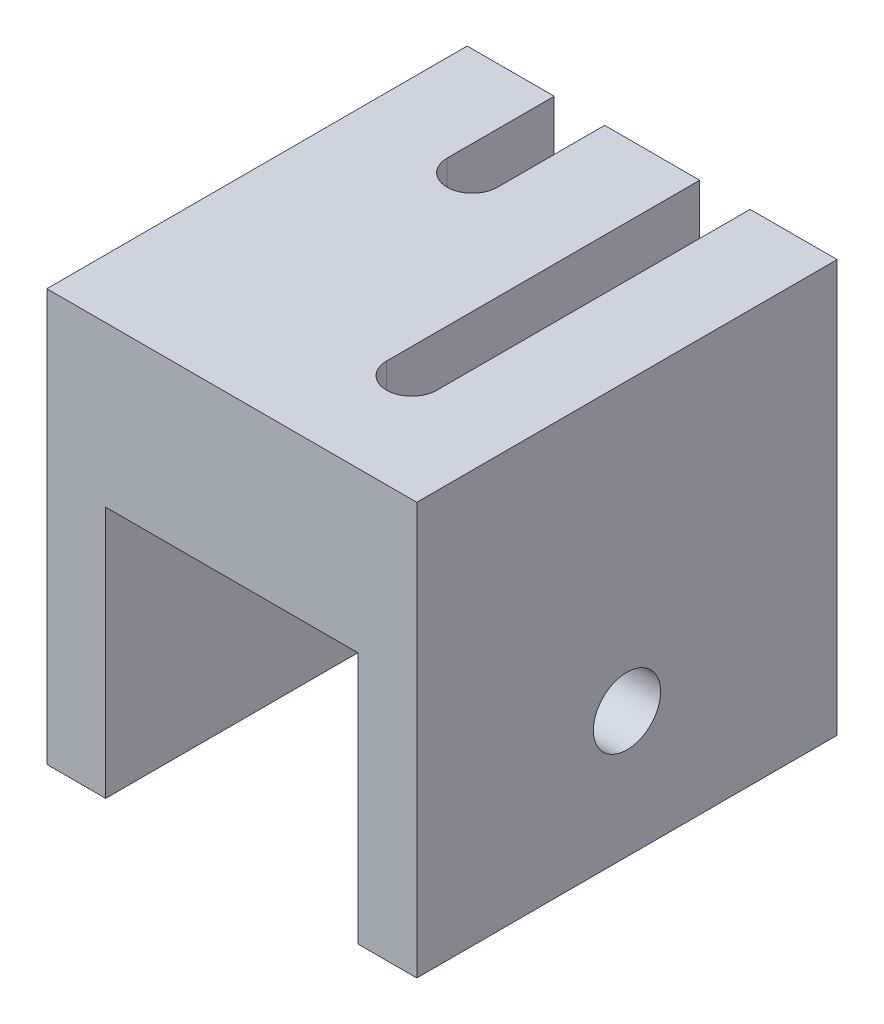
ISO-10303-21;
HEADER;
FILE_DESCRIPTION(('STEP AP214'),'2;1');
FILE_NAME('part.step','',(''),(''),'','','');
FILE_SCHEMA(('AUTOMOTIVE_DESIGN { 1 0 10303 214 1 1 1 1 }'));
ENDSEC;
DATA;
#1=APPLICATION_CONTEXT('core data for automotive mechanical design processes');
#2=APPLICATION_PROTOCOL_DEFINITION('international standard','automotive_design',2000,#1);
#3=PRODUCT_CONTEXT('',#1,'mechanical');
#4=PRODUCT('Part','Part','',(#3));
#5=PRODUCT_RELATED_PRODUCT_CATEGORY('part','',(#4));
#6=PRODUCT_DEFINITION_FORMATION('','',#4);
#7=PRODUCT_DEFINITION_CONTEXT('part definition',#1,'design');
#8=PRODUCT_DEFINITION('design','',#6,#7);
#9=PRODUCT_DEFINITION_SHAPE('','',#8);
#10=(LENGTH_UNIT() NAMED_UNIT(*) SI_UNIT(.MILLI.,.METRE.));
#11=(NAMED_UNIT(*) PLANE_ANGLE_UNIT() SI_UNIT($,.RADIAN.));
#12=(NAMED_UNIT(*) SI_UNIT($,.STERADIAN.) SOLID_ANGLE_UNIT());
#13=UNCERTAINTY_MEASURE_WITH_UNIT(LENGTH_MEASURE(1.E-05),#10,'distance_accuracy_value','');
#14=(GEOMETRIC_REPRESENTATION_CONTEXT(3) GLOBAL_UNCERTAINTY_ASSIGNED_CONTEXT((#13)) GLOBAL_UNIT_ASSIGNED_CONTEXT((#10,
#11,#12)) REPRESENTATION_CONTEXT('',''));
#15=CARTESIAN_POINT('',(0.,0.,0.));
#16=DIRECTION('',(0.,0.,1.));
#17=DIRECTION('',(1.,0.,0.));
#18=AXIS2_PLACEMENT_3D('',#15,#16,#17);
#19=CARTESIAN_POINT('',(0.,22.,50.));
#20=DIRECTION('',(0.,1.,0.));
#21=DIRECTION('',(0.,0.,1.));
#22=AXIS2_PLACEMENT_3D('',#19,#20,#21);
#23=PLANE('',#22);
#24=CARTESIAN_POINT('',(8.65024796436644,22.,37.2545179486985));
#25=DIRECTION('',(0.,1.,0.));
#26=DIRECTION('',(0.,0.,1.));
#27=AXIS2_PLACEMENT_3D('',#24,#25,#26);
#28=CIRCLE('',#27,5.);
#29=CARTESIAN_POINT('',(3.65024796436644,22.,37.2545179486985));
#30=VERTEX_POINT('',#29);
#31=CARTESIAN_POINT('',(13.6502479643664,22.,37.2545179486985));
#32=VERTEX_POINT('',#31);
#33=EDGE_CURVE('E229',#30,#32,#28,.T.);
#34=ORIENTED_EDGE('',*,*,#33,.T.);
#35=DIRECTION('',(0.,0.,-1.));
#36=VECTOR('',#35,1.);
#37=CARTESIAN_POINT('',(13.6502479643664,22.,0.));
#38=LINE('',#37,#36);
#39=CARTESIAN_POINT('',(13.6502479643664,22.,0.));
#40=VERTEX_POINT('',#39);
#41=EDGE_CURVE('E242',#32,#40,#38,.T.);
#42=ORIENTED_EDGE('',*,*,#41,.T.);
#43=DIRECTION('',(1.,0.,0.));
#44=VECTOR('',#43,1.);
#45=CARTESIAN_POINT('',(0.,22.,0.));
#46=LINE('',#45,#44);
#47=CARTESIAN_POINT('',(3.65024796436644,22.,0.));
#48=VERTEX_POINT('',#47);
#49=EDGE_CURVE('E306',#48,#40,#46,.T.);
#50=ORIENTED_EDGE('',*,*,#49,.F.);
#51=DIRECTION('',(0.,0.,-1.));
#52=VECTOR('',#51,1.);
#53=CARTESIAN_POINT('',(3.65024796436644,22.,0.));
#54=LINE('',#53,#52);
#55=EDGE_CURVE('E232',#30,#48,#54,.T.);
#56=ORIENTED_EDGE('',*,*,#55,.F.);
#57=EDGE_LOOP('',(#34,#42,#50,#56));
#58=FACE_BOUND('',#57,.T.);
#59=ADVANCED_FACE('F37',(#58),#23,.T.);
#60=CARTESIAN_POINT('',(0.,-15.,50.));
#61=DIRECTION('',(0.,1.,0.));
#62=DIRECTION('',(0.,0.,1.));
#63=AXIS2_PLACEMENT_3D('',#60,#61,#62);
#64=PLANE('',#63);
#65=DIRECTION('',(1.,0.,0.));
#66=VECTOR('',#65,1.);
#67=CARTESIAN_POINT('',(0.,-15.,0.));
#68=LINE('',#67,#66);
#69=CARTESIAN_POINT('',(15.,-15.,0.));
#70=VERTEX_POINT('',#69);
#71=CARTESIAN_POINT('',(22.,-15.,0.));
#72=VERTEX_POINT('',#71);
#73=EDGE_CURVE('E300',#70,#72,#68,.T.);
#74=ORIENTED_EDGE('',*,*,#73,.T.);
#75=DIRECTION('',(0.,0.,-1.));
#76=VECTOR('',#75,1.);
#77=CARTESIAN_POINT('',(22.,-15.,50.));
#78=LINE('',#77,#76);
#79=CARTESIAN_POINT('',(22.,-15.,50.));
#80=VERTEX_POINT('',#79);
#81=EDGE_CURVE('E310',#80,#72,#78,.T.);
#82=ORIENTED_EDGE('',*,*,#81,.F.);
#83=DIRECTION('',(1.,0.,0.));
#84=VECTOR('',#83,1.);
#85=CARTESIAN_POINT('',(0.,-15.,50.));
#86=LINE('',#85,#84);
#87=CARTESIAN_POINT('',(15.,-15.,50.));
#88=VERTEX_POINT('',#87);
#89=EDGE_CURVE('E287',#88,#80,#86,.T.);
#90=ORIENTED_EDGE('',*,*,#89,.F.);
#91=DIRECTION('',(0.,0.,-1.));
#92=VECTOR('',#91,1.);
#93=CARTESIAN_POINT('',(15.,-15.,50.));
#94=LINE('',#93,#92);
#95=EDGE_CURVE('E46',#88,#70,#94,.T.);
#96=ORIENTED_EDGE('',*,*,#95,.T.);
#97=EDGE_LOOP('',(#74,#82,#90,#96));
#98=FACE_BOUND('',#97,.T.);
#99=ADVANCED_FACE('F445',(#98),#64,.F.);
#100=CARTESIAN_POINT('',(22.,0.,50.));
#101=DIRECTION('',(-1.,0.,0.));
#102=DIRECTION('',(0.,0.,1.));
#103=AXIS2_PLACEMENT_3D('',#100,#101,#102);
#104=PLANE('',#103);
#105=CARTESIAN_POINT('',(22.,0.,25.));
#106=DIRECTION('',(-1.,0.,0.));
#107=DIRECTION('',(0.,0.,1.));
#108=AXIS2_PLACEMENT_3D('',#105,#106,#107);
#109=CIRCLE('',#108,4.);
#110=CARTESIAN_POINT('',(22.,0.,29.));
#111=VERTEX_POINT('',#110);
#112=EDGE_CURVE('E418',#111,#111,#109,.T.);
#113=ORIENTED_EDGE('',*,*,#112,.T.);
#114=EDGE_LOOP('',(#113));
#115=FACE_BOUND('',#114,.T.);
#116=DIRECTION('',(0.,1.,0.));
#117=VECTOR('',#116,1.);
#118=CARTESIAN_POINT('',(22.,0.,0.));
#119=LINE('',#118,#117);
#120=CARTESIAN_POINT('',(22.,34.,0.));
#121=VERTEX_POINT('',#120);
#122=EDGE_CURVE('E303',#72,#121,#119,.T.);
#123=ORIENTED_EDGE('',*,*,#122,.T.);
#124=DIRECTION('',(0.,0.,-1.));
#125=VECTOR('',#124,1.);
#126=CARTESIAN_POINT('',(22.,34.,0.));
#127=LINE('',#126,#125);
#128=CARTESIAN_POINT('',(22.,34.,50.));
#129=VERTEX_POINT('',#128);
#130=EDGE_CURVE('E354',#129,#121,#127,.T.);
#131=ORIENTED_EDGE('',*,*,#130,.F.);
#132=DIRECTION('',(0.,1.,0.));
#133=VECTOR('',#132,1.);
#134=CARTESIAN_POINT('',(22.,0.,50.));
#135=LINE('',#134,#133);
#136=EDGE_CURVE('E290',#80,#129,#135,.T.);
#137=ORIENTED_EDGE('',*,*,#136,.F.);
#138=ORIENTED_EDGE('',*,*,#81,.T.);
#139=EDGE_LOOP('',(#123,#131,#137,#138));
#140=FACE_BOUND('',#139,.T.);
#141=ADVANCED_FACE('F452',(#115,#140),#104,.F.);
#142=CARTESIAN_POINT('',(0.,0.,50.));
#143=DIRECTION('',(0.,0.,1.));
#144=DIRECTION('',(1.,0.,0.));
#145=AXIS2_PLACEMENT_3D('',#142,#143,#144);
#146=PLANE('',#145);
#147=DIRECTION('',(1.,0.,0.));
#148=VECTOR('',#147,1.);
#149=CARTESIAN_POINT('',(0.,15.,50.));
#150=LINE('',#149,#148);
#151=CARTESIAN_POINT('',(-15.,15.,50.));
#152=VERTEX_POINT('',#151);
#153=CARTESIAN_POINT('',(15.,15.,50.));
#154=VERTEX_POINT('',#153);
#155=EDGE_CURVE('E280',#152,#154,#150,.T.);
#156=ORIENTED_EDGE('',*,*,#155,.T.);
#157=DIRECTION('',(0.,1.,0.));
#158=VECTOR('',#157,1.);
#159=CARTESIAN_POINT('',(15.,0.,50.));
#160=LINE('',#159,#158);
#161=EDGE_CURVE('E283',#88,#154,#160,.T.);
#162=ORIENTED_EDGE('',*,*,#161,.F.);
#163=ORIENTED_EDGE('',*,*,#89,.T.);
#164=ORIENTED_EDGE('',*,*,#136,.T.);
#165=DIRECTION('',(1.,0.,0.));
#166=VECTOR('',#165,1.);
#167=CARTESIAN_POINT('',(0.,34.,50.));
#168=LINE('',#167,#166);
#169=CARTESIAN_POINT('',(-22.,34.,50.));
#170=VERTEX_POINT('',#169);
#171=EDGE_CURVE('E351',#170,#129,#168,.T.);
#172=ORIENTED_EDGE('',*,*,#171,.F.);
#173=DIRECTION('',(0.,1.,0.));
#174=VECTOR('',#173,1.);
#175=CARTESIAN_POINT('',(-22.,-15.,50.));
#176=LINE('',#175,#174);
#177=CARTESIAN_POINT('',(-22.,-15.,50.));
#178=VERTEX_POINT('',#177);
#179=EDGE_CURVE('E315',#178,#170,#176,.T.);
#180=ORIENTED_EDGE('',*,*,#179,.F.);
#181=DIRECTION('',(-1.,0.,0.));
#182=VECTOR('',#181,1.);
#183=CARTESIAN_POINT('',(-15.,-15.,50.));
#184=LINE('',#183,#182);
#185=CARTESIAN_POINT('',(-15.,-15.,50.));
#186=VERTEX_POINT('',#185);
#187=EDGE_CURVE('E318',#186,#178,#184,.T.);
#188=ORIENTED_EDGE('',*,*,#187,.F.);
#189=DIRECTION('',(0.,1.,0.));
#190=VECTOR('',#189,1.);
#191=CARTESIAN_POINT('',(-15.,-15.,50.));
#192=LINE('',#191,#190);
#193=EDGE_CURVE('E322',#186,#152,#192,.T.);
#194=ORIENTED_EDGE('',*,*,#193,.T.);
#195=EDGE_LOOP('',(#156,#162,#163,#164,#172,#180,#188,#194));
#196=FACE_BOUND('',#195,.T.);
#197=ADVANCED_FACE('F349',(#196),#146,.T.);
#198=CARTESIAN_POINT('',(15.,0.,50.));
#199=DIRECTION('',(-1.,0.,0.));
#200=DIRECTION('',(0.,0.,1.));
#201=AXIS2_PLACEMENT_3D('',#198,#199,#200);
#202=PLANE('',#201);
#203=CARTESIAN_POINT('',(15.,0.,25.));
#204=DIRECTION('',(-1.,0.,0.));
#205=DIRECTION('',(0.,0.,1.));
#206=AXIS2_PLACEMENT_3D('',#203,#204,#205);
#207=CIRCLE('',#206,4.);
#208=CARTESIAN_POINT('',(15.,0.,29.));
#209=VERTEX_POINT('',#208);
#210=EDGE_CURVE('E421',#209,#209,#207,.T.);
#211=ORIENTED_EDGE('',*,*,#210,.F.);
#212=EDGE_LOOP('',(#211));
#213=FACE_BOUND('',#212,.T.);
#214=DIRECTION('',(0.,1.,0.));
#215=VECTOR('',#214,1.);
#216=CARTESIAN_POINT('',(15.,0.,0.));
#217=LINE('',#216,#215);
#218=CARTESIAN_POINT('',(15.,15.,0.));
#219=VERTEX_POINT('',#218);
#220=EDGE_CURVE('E296',#70,#219,#217,.T.);
#221=ORIENTED_EDGE('',*,*,#220,.F.);
#222=ORIENTED_EDGE('',*,*,#95,.F.);
#223=ORIENTED_EDGE('',*,*,#161,.T.);
#224=DIRECTION('',(0.,0.,-1.));
#225=VECTOR('',#224,1.);
#226=CARTESIAN_POINT('',(15.,15.,50.));
#227=LINE('',#226,#225);
#228=EDGE_CURVE('E11',#154,#219,#227,.T.);
#229=ORIENTED_EDGE('',*,*,#228,.T.);
#230=EDGE_LOOP('',(#221,#222,#223,#229));
#231=FACE_BOUND('',#230,.T.);
#232=ADVANCED_FACE('F494',(#213,#231),#202,.T.);
#233=CARTESIAN_POINT('',(0.,0.,0.));
#234=DIRECTION('',(0.,0.,1.));
#235=DIRECTION('',(1.,0.,0.));
#236=AXIS2_PLACEMENT_3D('',#233,#234,#235);
#237=PLANE('',#236);
#238=DIRECTION('',(1.,0.,0.));
#239=VECTOR('',#238,1.);
#240=CARTESIAN_POINT('',(0.,15.,0.));
#241=LINE('',#240,#239);
#242=CARTESIAN_POINT('',(-15.,15.,0.));
#243=VERTEX_POINT('',#242);
#244=EDGE_CURVE('E294',#243,#219,#241,.T.);
#245=ORIENTED_EDGE('',*,*,#244,.F.);
#246=DIRECTION('',(0.,1.,0.));
#247=VECTOR('',#246,1.);
#248=CARTESIAN_POINT('',(-15.,-15.,0.));
#249=LINE('',#248,#247);
#250=CARTESIAN_POINT('',(-15.,-15.,0.));
#251=VERTEX_POINT('',#250);
#252=EDGE_CURVE('E319',#251,#243,#249,.T.);
#253=ORIENTED_EDGE('',*,*,#252,.F.);
#254=DIRECTION('',(-1.,0.,0.));
#255=VECTOR('',#254,1.);
#256=CARTESIAN_POINT('',(-15.,-15.,0.));
#257=LINE('',#256,#255);
#258=CARTESIAN_POINT('',(-22.,-15.,0.));
#259=VERTEX_POINT('',#258);
#260=EDGE_CURVE('E328',#251,#259,#257,.T.);
#261=ORIENTED_EDGE('',*,*,#260,.T.);
#262=DIRECTION('',(0.,1.,0.));
#263=VECTOR('',#262,1.);
#264=CARTESIAN_POINT('',(-22.,-15.,0.));
#265=LINE('',#264,#263);
#266=CARTESIAN_POINT('',(-22.,34.,0.));
#267=VERTEX_POINT('',#266);
#268=EDGE_CURVE('E279',#259,#267,#265,.T.);
#269=ORIENTED_EDGE('',*,*,#268,.T.);
#270=DIRECTION('',(-1.,0.,0.));
#271=VECTOR('',#270,1.);
#272=CARTESIAN_POINT('',(0.,34.,0.));
#273=LINE('',#272,#271);
#274=CARTESIAN_POINT('',(-11.6502479643664,34.,0.));
#275=VERTEX_POINT('',#274);
#276=EDGE_CURVE('E358',#275,#267,#273,.T.);
#277=ORIENTED_EDGE('',*,*,#276,.F.);
#278=DIRECTION('',(0.,-1.,0.));
#279=VECTOR('',#278,1.);
#280=CARTESIAN_POINT('',(-11.6502479643664,34.,0.));
#281=LINE('',#280,#279);
#282=CARTESIAN_POINT('',(-11.6502479643664,28.,0.));
#283=VERTEX_POINT('',#282);
#284=EDGE_CURVE('E398',#275,#283,#281,.T.);
#285=ORIENTED_EDGE('',*,*,#284,.T.);
#286=DIRECTION('',(-1.,0.,0.));
#287=VECTOR('',#286,1.);
#288=CARTESIAN_POINT('',(0.,28.,0.));
#289=LINE('',#288,#287);
#290=CARTESIAN_POINT('',(-13.6502479643664,28.,0.));
#291=VERTEX_POINT('',#290);
#292=EDGE_CURVE('E378',#283,#291,#289,.T.);
#293=ORIENTED_EDGE('',*,*,#292,.T.);
#294=DIRECTION('',(0.,-1.,0.));
#295=VECTOR('',#294,1.);
#296=CARTESIAN_POINT('',(-13.6502479643664,28.,0.));
#297=LINE('',#296,#295);
#298=CARTESIAN_POINT('',(-13.6502479643664,22.,0.));
#299=VERTEX_POINT('',#298);
#300=EDGE_CURVE('E267',#291,#299,#297,.T.);
#301=ORIENTED_EDGE('',*,*,#300,.T.);
#302=CARTESIAN_POINT('',(-3.65024796436643,22.,0.));
#303=VERTEX_POINT('',#302);
#304=EDGE_CURVE('E284',#299,#303,#46,.T.);
#305=ORIENTED_EDGE('',*,*,#304,.T.);
#306=DIRECTION('',(0.,-1.,0.));
#307=VECTOR('',#306,1.);
#308=CARTESIAN_POINT('',(-3.65024796436643,28.,0.));
#309=LINE('',#308,#307);
#310=CARTESIAN_POINT('',(-3.65024796436643,28.,0.));
#311=VERTEX_POINT('',#310);
#312=EDGE_CURVE('E272',#311,#303,#309,.T.);
#313=ORIENTED_EDGE('',*,*,#312,.F.);
#314=DIRECTION('',(1.,0.,0.));
#315=VECTOR('',#314,1.);
#316=CARTESIAN_POINT('',(0.,28.,0.));
#317=LINE('',#316,#315);
#318=CARTESIAN_POINT('',(-5.65024796436643,28.,0.));
#319=VERTEX_POINT('',#318);
#320=EDGE_CURVE('E228',#319,#311,#317,.T.);
#321=ORIENTED_EDGE('',*,*,#320,.F.);
#322=DIRECTION('',(0.,-1.,0.));
#323=VECTOR('',#322,1.);
#324=CARTESIAN_POINT('',(-5.65024796436643,34.,0.));
#325=LINE('',#324,#323);
#326=CARTESIAN_POINT('',(-5.65024796436643,34.,0.));
#327=VERTEX_POINT('',#326);
#328=EDGE_CURVE('E206',#327,#319,#325,.T.);
#329=ORIENTED_EDGE('',*,*,#328,.F.);
#330=DIRECTION('',(1.,0.,0.));
#331=VECTOR('',#330,1.);
#332=CARTESIAN_POINT('',(0.,34.,0.));
#333=LINE('',#332,#331);
#334=CARTESIAN_POINT('',(5.65024796436644,34.,0.));
#335=VERTEX_POINT('',#334);
#336=EDGE_CURVE('E213',#327,#335,#333,.T.);
#337=ORIENTED_EDGE('',*,*,#336,.T.);
#338=DIRECTION('',(0.,-1.,0.));
#339=VECTOR('',#338,1.);
#340=CARTESIAN_POINT('',(5.65024796436644,34.,0.));
#341=LINE('',#340,#339);
#342=CARTESIAN_POINT('',(5.65024796436644,28.,0.));
#343=VERTEX_POINT('',#342);
#344=EDGE_CURVE('E369',#335,#343,#341,.T.);
#345=ORIENTED_EDGE('',*,*,#344,.T.);
#346=CARTESIAN_POINT('',(3.65024796436644,28.,0.));
#347=VERTEX_POINT('',#346);
#348=EDGE_CURVE('E372',#347,#343,#317,.T.);
#349=ORIENTED_EDGE('',*,*,#348,.F.);
#350=DIRECTION('',(0.,-1.,0.));
#351=VECTOR('',#350,1.);
#352=CARTESIAN_POINT('',(3.65024796436644,28.,0.));
#353=LINE('',#352,#351);
#354=EDGE_CURVE('E275',#347,#48,#353,.T.);
#355=ORIENTED_EDGE('',*,*,#354,.T.);
#356=ORIENTED_EDGE('',*,*,#49,.T.);
#357=DIRECTION('',(0.,-1.,0.));
#358=VECTOR('',#357,1.);
#359=CARTESIAN_POINT('',(13.6502479643664,28.,0.));
#360=LINE('',#359,#358);
#361=CARTESIAN_POINT('',(13.6502479643664,28.,0.));
#362=VERTEX_POINT('',#361);
#363=EDGE_CURVE('E265',#362,#40,#360,.T.);
#364=ORIENTED_EDGE('',*,*,#363,.F.);
#365=DIRECTION('',(-1.,0.,0.));
#366=VECTOR('',#365,1.);
#367=CARTESIAN_POINT('',(0.,28.,0.));
#368=LINE('',#367,#366);
#369=CARTESIAN_POINT('',(11.6502479643664,28.,0.));
#370=VERTEX_POINT('',#369);
#371=EDGE_CURVE('E381',#362,#370,#368,.T.);
#372=ORIENTED_EDGE('',*,*,#371,.T.);
#373=DIRECTION('',(0.,-1.,0.));
#374=VECTOR('',#373,1.);
#375=CARTESIAN_POINT('',(11.6502479643664,34.,0.));
#376=LINE('',#375,#374);
#377=CARTESIAN_POINT('',(11.6502479643664,34.,0.));
#378=VERTEX_POINT('',#377);
#379=EDGE_CURVE('E395',#378,#370,#376,.T.);
#380=ORIENTED_EDGE('',*,*,#379,.F.);
#381=DIRECTION('',(-1.,0.,0.));
#382=VECTOR('',#381,1.);
#383=CARTESIAN_POINT('',(0.,34.,0.));
#384=LINE('',#383,#382);
#385=EDGE_CURVE('E356',#121,#378,#384,.T.);
#386=ORIENTED_EDGE('',*,*,#385,.F.);
#387=ORIENTED_EDGE('',*,*,#122,.F.);
#388=ORIENTED_EDGE('',*,*,#73,.F.);
#389=ORIENTED_EDGE('',*,*,#220,.T.);
#390=EDGE_LOOP('',(#245,#253,#261,#269,#277,#285,#293,#301,#305,#313,#321,#329,#337,#345,#349,
#355,#356,#364,#372,#380,#386,#387,#388,#389));
#391=FACE_BOUND('',#390,.T.);
#392=ADVANCED_FACE('F225',(#391),#237,.F.);
#393=CARTESIAN_POINT('',(0.,15.,50.));
#394=DIRECTION('',(0.,1.,0.));
#395=DIRECTION('',(0.,0.,1.));
#396=AXIS2_PLACEMENT_3D('',#393,#394,#395);
#397=PLANE('',#396);
#398=ORIENTED_EDGE('',*,*,#244,.T.);
#399=ORIENTED_EDGE('',*,*,#228,.F.);
#400=ORIENTED_EDGE('',*,*,#155,.F.);
#401=DIRECTION('',(0.,0.,-1.));
#402=VECTOR('',#401,1.);
#403=CARTESIAN_POINT('',(-15.,15.,50.));
#404=LINE('',#403,#402);
#405=EDGE_CURVE('E293',#152,#243,#404,.T.);
#406=ORIENTED_EDGE('',*,*,#405,.T.);
#407=EDGE_LOOP('',(#398,#399,#400,#406));
#408=FACE_BOUND('',#407,.T.);
#409=ADVANCED_FACE('F458',(#408),#397,.F.);
#410=DIRECTION('',(0.,0.,-1.));
#411=VECTOR('',#410,1.);
#412=CARTESIAN_POINT('',(-13.6502479643664,22.,0.));
#413=LINE('',#412,#411);
#414=CARTESIAN_POINT('',(-13.6502479643664,22.,12.7454820513015));
#415=VERTEX_POINT('',#414);
#416=EDGE_CURVE('E260',#415,#299,#413,.T.);
#417=ORIENTED_EDGE('',*,*,#416,.F.);
#418=CARTESIAN_POINT('',(-8.65024796436643,22.,12.7454820513015));
#419=DIRECTION('',(0.,1.,0.));
#420=DIRECTION('',(0.,0.,1.));
#421=AXIS2_PLACEMENT_3D('',#418,#419,#420);
#422=CIRCLE('',#421,5.);
#423=CARTESIAN_POINT('',(-3.65024796436643,22.,12.7454820513015));
#424=VERTEX_POINT('',#423);
#425=EDGE_CURVE('E257',#415,#424,#422,.T.);
#426=ORIENTED_EDGE('',*,*,#425,.T.);
#427=DIRECTION('',(0.,0.,-1.));
#428=VECTOR('',#427,1.);
#429=CARTESIAN_POINT('',(-3.65024796436643,22.,0.));
#430=LINE('',#429,#428);
#431=EDGE_CURVE('E255',#424,#303,#430,.T.);
#432=ORIENTED_EDGE('',*,*,#431,.T.);
#433=ORIENTED_EDGE('',*,*,#304,.F.);
#434=EDGE_LOOP('',(#417,#426,#432,#433));
#435=FACE_BOUND('',#434,.T.);
#436=ADVANCED_FACE('F448',(#435),#23,.T.);
#437=CARTESIAN_POINT('',(-22.,-15.,50.));
#438=DIRECTION('',(-1.,0.,0.));
#439=DIRECTION('',(0.,0.,1.));
#440=AXIS2_PLACEMENT_3D('',#437,#438,#439);
#441=PLANE('',#440);
#442=CARTESIAN_POINT('',(-22.,0.,25.));
#443=DIRECTION('',(-1.,0.,0.));
#444=DIRECTION('',(0.,0.,1.));
#445=AXIS2_PLACEMENT_3D('',#442,#443,#444);
#446=CIRCLE('',#445,4.);
#447=CARTESIAN_POINT('',(-22.,0.,29.));
#448=VERTEX_POINT('',#447);
#449=EDGE_CURVE('E424',#448,#448,#446,.T.);
#450=ORIENTED_EDGE('',*,*,#449,.F.);
#451=EDGE_LOOP('',(#450));
#452=FACE_BOUND('',#451,.T.);
#453=ORIENTED_EDGE('',*,*,#268,.F.);
#454=DIRECTION('',(0.,0.,-1.));
#455=VECTOR('',#454,1.);
#456=CARTESIAN_POINT('',(-22.,-15.,50.));
#457=LINE('',#456,#455);
#458=EDGE_CURVE('E297',#178,#259,#457,.T.);
#459=ORIENTED_EDGE('',*,*,#458,.F.);
#460=ORIENTED_EDGE('',*,*,#179,.T.);
#461=DIRECTION('',(0.,0.,1.));
#462=VECTOR('',#461,1.);
#463=CARTESIAN_POINT('',(-22.,34.,0.));
#464=LINE('',#463,#462);
#465=EDGE_CURVE('E341',#267,#170,#464,.T.);
#466=ORIENTED_EDGE('',*,*,#465,.F.);
#467=EDGE_LOOP('',(#453,#459,#460,#466));
#468=FACE_BOUND('',#467,.T.);
#469=ADVANCED_FACE('F39',(#452,#468),#441,.T.);
#470=CARTESIAN_POINT('',(-15.,-15.,50.));
#471=DIRECTION('',(0.,-1.,0.));
#472=DIRECTION('',(0.,0.,-1.));
#473=AXIS2_PLACEMENT_3D('',#470,#471,#472);
#474=PLANE('',#473);
#475=ORIENTED_EDGE('',*,*,#260,.F.);
#476=DIRECTION('',(0.,0.,-1.));
#477=VECTOR('',#476,1.);
#478=CARTESIAN_POINT('',(-15.,-15.,50.));
#479=LINE('',#478,#477);
#480=EDGE_CURVE('E325',#186,#251,#479,.T.);
#481=ORIENTED_EDGE('',*,*,#480,.F.);
#482=ORIENTED_EDGE('',*,*,#187,.T.);
#483=ORIENTED_EDGE('',*,*,#458,.T.);
#484=EDGE_LOOP('',(#475,#481,#482,#483));
#485=FACE_BOUND('',#484,.T.);
#486=ADVANCED_FACE('F336',(#485),#474,.T.);
#487=CARTESIAN_POINT('',(-15.,-15.,50.));
#488=DIRECTION('',(-1.,0.,0.));
#489=DIRECTION('',(0.,0.,1.));
#490=AXIS2_PLACEMENT_3D('',#487,#488,#489);
#491=PLANE('',#490);
#492=CARTESIAN_POINT('',(-15.,0.,25.));
#493=DIRECTION('',(-1.,0.,0.));
#494=DIRECTION('',(0.,0.,1.));
#495=AXIS2_PLACEMENT_3D('',#492,#493,#494);
#496=CIRCLE('',#495,4.);
#497=CARTESIAN_POINT('',(-15.,0.,29.));
#498=VERTEX_POINT('',#497);
#499=EDGE_CURVE('E41',#498,#498,#496,.T.);
#500=ORIENTED_EDGE('',*,*,#499,.T.);
#501=EDGE_LOOP('',(#500));
#502=FACE_BOUND('',#501,.T.);
#503=ORIENTED_EDGE('',*,*,#405,.F.);
#504=ORIENTED_EDGE('',*,*,#193,.F.);
#505=ORIENTED_EDGE('',*,*,#480,.T.);
#506=ORIENTED_EDGE('',*,*,#252,.T.);
#507=EDGE_LOOP('',(#503,#504,#505,#506));
#508=FACE_BOUND('',#507,.T.);
#509=ADVANCED_FACE('F345',(#502,#508),#491,.F.);
#510=CARTESIAN_POINT('',(8.65024796436644,28.,37.2545179486985));
#511=DIRECTION('',(0.,-1.,0.));
#512=DIRECTION('',(0.,0.,-1.));
#513=AXIS2_PLACEMENT_3D('',#510,#511,#512);
#514=CYLINDRICAL_SURFACE('',#513,5.);
#515=ORIENTED_EDGE('',*,*,#33,.F.);
#516=DIRECTION('',(0.,-1.,0.));
#517=VECTOR('',#516,1.);
#518=CARTESIAN_POINT('',(3.65024796436644,28.,37.2545179486985));
#519=LINE('',#518,#517);
#520=CARTESIAN_POINT('',(3.65024796436644,28.,37.2545179486985));
#521=VERTEX_POINT('',#520);
#522=EDGE_CURVE('E277',#521,#30,#519,.T.);
#523=ORIENTED_EDGE('',*,*,#522,.F.);
#524=CARTESIAN_POINT('',(8.65024796436644,28.,37.2545179486985));
#525=DIRECTION('',(0.,1.,0.));
#526=DIRECTION('',(0.,0.,1.));
#527=AXIS2_PLACEMENT_3D('',#524,#525,#526);
#528=CIRCLE('',#527,5.);
#529=CARTESIAN_POINT('',(13.6502479643664,28.,37.2545179486985));
#530=VERTEX_POINT('',#529);
#531=EDGE_CURVE('E238',#521,#530,#528,.T.);
#532=ORIENTED_EDGE('',*,*,#531,.T.);
#533=DIRECTION('',(0.,-1.,0.));
#534=VECTOR('',#533,1.);
#535=CARTESIAN_POINT('',(13.6502479643664,28.,37.2545179486985));
#536=LINE('',#535,#534);
#537=EDGE_CURVE('E251',#530,#32,#536,.T.);
#538=ORIENTED_EDGE('',*,*,#537,.T.);
#539=EDGE_LOOP('',(#515,#523,#532,#538));
#540=FACE_BOUND('',#539,.T.);
#541=ADVANCED_FACE('F488',(#540),#514,.F.);
#542=CARTESIAN_POINT('',(3.65024796436644,28.,0.));
#543=DIRECTION('',(-1.,0.,0.));
#544=DIRECTION('',(0.,0.,1.));
#545=AXIS2_PLACEMENT_3D('',#542,#543,#544);
#546=PLANE('',#545);
#547=ORIENTED_EDGE('',*,*,#55,.T.);
#548=ORIENTED_EDGE('',*,*,#354,.F.);
#549=DIRECTION('',(0.,0.,-1.));
#550=VECTOR('',#549,1.);
#551=CARTESIAN_POINT('',(3.65024796436644,28.,0.));
#552=LINE('',#551,#550);
#553=EDGE_CURVE('E241',#521,#347,#552,.T.);
#554=ORIENTED_EDGE('',*,*,#553,.F.);
#555=ORIENTED_EDGE('',*,*,#522,.T.);
#556=EDGE_LOOP('',(#547,#548,#554,#555));
#557=FACE_BOUND('',#556,.T.);
#558=ADVANCED_FACE('F482',(#557),#546,.F.);
#559=CARTESIAN_POINT('',(-3.65024796436643,28.,0.));
#560=DIRECTION('',(-1.,0.,0.));
#561=DIRECTION('',(0.,0.,1.));
#562=AXIS2_PLACEMENT_3D('',#559,#560,#561);
#563=PLANE('',#562);
#564=ORIENTED_EDGE('',*,*,#431,.F.);
#565=DIRECTION('',(0.,-1.,0.));
#566=VECTOR('',#565,1.);
#567=CARTESIAN_POINT('',(-3.65024796436643,28.,12.7454820513015));
#568=LINE('',#567,#566);
#569=CARTESIAN_POINT('',(-3.65024796436643,28.,12.7454820513015));
#570=VERTEX_POINT('',#569);
#571=EDGE_CURVE('E61',#570,#424,#568,.T.);
#572=ORIENTED_EDGE('',*,*,#571,.F.);
#573=DIRECTION('',(0.,0.,-1.));
#574=VECTOR('',#573,1.);
#575=CARTESIAN_POINT('',(-3.65024796436643,28.,0.));
#576=LINE('',#575,#574);
#577=EDGE_CURVE('E244',#570,#311,#576,.T.);
#578=ORIENTED_EDGE('',*,*,#577,.T.);
#579=ORIENTED_EDGE('',*,*,#312,.T.);
#580=EDGE_LOOP('',(#564,#572,#578,#579));
#581=FACE_BOUND('',#580,.T.);
#582=ADVANCED_FACE('F472',(#581),#563,.T.);
#583=CARTESIAN_POINT('',(-8.65024796436643,28.,12.7454820513015));
#584=DIRECTION('',(0.,-1.,0.));
#585=DIRECTION('',(0.,0.,-1.));
#586=AXIS2_PLACEMENT_3D('',#583,#584,#585);
#587=CYLINDRICAL_SURFACE('',#586,5.);
#588=ORIENTED_EDGE('',*,*,#425,.F.);
#589=DIRECTION('',(0.,-1.,0.));
#590=VECTOR('',#589,1.);
#591=CARTESIAN_POINT('',(-13.6502479643664,28.,12.7454820513015));
#592=LINE('',#591,#590);
#593=CARTESIAN_POINT('',(-13.6502479643664,28.,12.7454820513015));
#594=VERTEX_POINT('',#593);
#595=EDGE_CURVE('E54',#594,#415,#592,.T.);
#596=ORIENTED_EDGE('',*,*,#595,.F.);
#597=CARTESIAN_POINT('',(-8.65024796436643,28.,12.7454820513015));
#598=DIRECTION('',(0.,1.,0.));
#599=DIRECTION('',(0.,0.,1.));
#600=AXIS2_PLACEMENT_3D('',#597,#598,#599);
#601=CIRCLE('',#600,5.);
#602=EDGE_CURVE('E246',#594,#570,#601,.T.);
#603=ORIENTED_EDGE('',*,*,#602,.T.);
#604=ORIENTED_EDGE('',*,*,#571,.T.);
#605=EDGE_LOOP('',(#588,#596,#603,#604));
#606=FACE_BOUND('',#605,.T.);
#607=ADVANCED_FACE('F473',(#606),#587,.F.);
#608=CARTESIAN_POINT('',(-13.6502479643664,28.,0.));
#609=DIRECTION('',(-1.,0.,0.));
#610=DIRECTION('',(0.,0.,1.));
#611=AXIS2_PLACEMENT_3D('',#608,#609,#610);
#612=PLANE('',#611);
#613=ORIENTED_EDGE('',*,*,#416,.T.);
#614=ORIENTED_EDGE('',*,*,#300,.F.);
#615=DIRECTION('',(0.,0.,-1.));
#616=VECTOR('',#615,1.);
#617=CARTESIAN_POINT('',(-13.6502479643664,28.,0.));
#618=LINE('',#617,#616);
#619=EDGE_CURVE('E248',#594,#291,#618,.T.);
#620=ORIENTED_EDGE('',*,*,#619,.F.);
#621=ORIENTED_EDGE('',*,*,#595,.T.);
#622=EDGE_LOOP('',(#613,#614,#620,#621));
#623=FACE_BOUND('',#622,.T.);
#624=ADVANCED_FACE('F470',(#623),#612,.F.);
#625=CARTESIAN_POINT('',(13.6502479643664,28.,0.));
#626=DIRECTION('',(-1.,0.,0.));
#627=DIRECTION('',(0.,0.,1.));
#628=AXIS2_PLACEMENT_3D('',#625,#626,#627);
#629=PLANE('',#628);
#630=ORIENTED_EDGE('',*,*,#41,.F.);
#631=ORIENTED_EDGE('',*,*,#537,.F.);
#632=DIRECTION('',(0.,0.,-1.));
#633=VECTOR('',#632,1.);
#634=CARTESIAN_POINT('',(13.6502479643664,28.,0.));
#635=LINE('',#634,#633);
#636=EDGE_CURVE('E250',#530,#362,#635,.T.);
#637=ORIENTED_EDGE('',*,*,#636,.T.);
#638=ORIENTED_EDGE('',*,*,#363,.T.);
#639=EDGE_LOOP('',(#630,#631,#637,#638));
#640=FACE_BOUND('',#639,.T.);
#641=ADVANCED_FACE('F480',(#640),#629,.T.);
#642=CARTESIAN_POINT('',(0.,28.,0.));
#643=DIRECTION('',(0.,1.,0.));
#644=DIRECTION('',(0.,0.,1.));
#645=AXIS2_PLACEMENT_3D('',#642,#643,#644);
#646=PLANE('',#645);
#647=ORIENTED_EDGE('',*,*,#531,.F.);
#648=ORIENTED_EDGE('',*,*,#553,.T.);
#649=ORIENTED_EDGE('',*,*,#348,.T.);
#650=DIRECTION('',(0.,0.,-1.));
#651=VECTOR('',#650,1.);
#652=CARTESIAN_POINT('',(5.65024796436644,28.,0.));
#653=LINE('',#652,#651);
#654=CARTESIAN_POINT('',(5.65024796436644,28.,37.2545179486985));
#655=VERTEX_POINT('',#654);
#656=EDGE_CURVE('E222',#655,#343,#653,.T.);
#657=ORIENTED_EDGE('',*,*,#656,.F.);
#658=CARTESIAN_POINT('',(8.65024796436644,28.,37.2545179486985));
#659=DIRECTION('',(0.,1.,0.));
#660=DIRECTION('',(0.,0.,1.));
#661=AXIS2_PLACEMENT_3D('',#658,#659,#660);
#662=CIRCLE('',#661,3.);
#663=CARTESIAN_POINT('',(11.6502479643664,28.,37.2545179486985));
#664=VERTEX_POINT('',#663);
#665=EDGE_CURVE('E386',#655,#664,#662,.T.);
#666=ORIENTED_EDGE('',*,*,#665,.T.);
#667=DIRECTION('',(0.,0.,-1.));
#668=VECTOR('',#667,1.);
#669=CARTESIAN_POINT('',(11.6502479643664,28.,0.));
#670=LINE('',#669,#668);
#671=EDGE_CURVE('E384',#664,#370,#670,.T.);
#672=ORIENTED_EDGE('',*,*,#671,.T.);
#673=ORIENTED_EDGE('',*,*,#371,.F.);
#674=ORIENTED_EDGE('',*,*,#636,.F.);
#675=EDGE_LOOP('',(#647,#648,#649,#657,#666,#672,#673,#674));
#676=FACE_BOUND('',#675,.T.);
#677=ADVANCED_FACE('F442',(#676),#646,.F.);
#678=CARTESIAN_POINT('',(-5.65024796436643,34.,0.));
#679=DIRECTION('',(-1.,0.,0.));
#680=DIRECTION('',(0.,0.,1.));
#681=AXIS2_PLACEMENT_3D('',#678,#679,#680);
#682=PLANE('',#681);
#683=DIRECTION('',(0.,0.,-1.));
#684=VECTOR('',#683,1.);
#685=CARTESIAN_POINT('',(-5.65024796436643,28.,0.));
#686=LINE('',#685,#684);
#687=CARTESIAN_POINT('',(-5.65024796436643,28.,12.7454820513015));
#688=VERTEX_POINT('',#687);
#689=EDGE_CURVE('E371',#688,#319,#686,.T.);
#690=ORIENTED_EDGE('',*,*,#689,.F.);
#691=DIRECTION('',(0.,-1.,0.));
#692=VECTOR('',#691,1.);
#693=CARTESIAN_POINT('',(-5.65024796436643,34.,12.7454820513015));
#694=LINE('',#693,#692);
#695=CARTESIAN_POINT('',(-5.65024796436643,34.,12.7454820513015));
#696=VERTEX_POINT('',#695);
#697=EDGE_CURVE('E209',#696,#688,#694,.T.);
#698=ORIENTED_EDGE('',*,*,#697,.F.);
#699=DIRECTION('',(0.,0.,-1.));
#700=VECTOR('',#699,1.);
#701=CARTESIAN_POINT('',(-5.65024796436643,34.,0.));
#702=LINE('',#701,#700);
#703=EDGE_CURVE('E201',#696,#327,#702,.T.);
#704=ORIENTED_EDGE('',*,*,#703,.T.);
#705=ORIENTED_EDGE('',*,*,#328,.T.);
#706=EDGE_LOOP('',(#690,#698,#704,#705));
#707=FACE_BOUND('',#706,.T.);
#708=ADVANCED_FACE('F204',(#707),#682,.T.);
#709=CARTESIAN_POINT('',(-8.65024796436643,34.,12.7454820513015));
#710=DIRECTION('',(0.,-1.,0.));
#711=DIRECTION('',(0.,0.,-1.));
#712=AXIS2_PLACEMENT_3D('',#709,#710,#711);
#713=CYLINDRICAL_SURFACE('',#712,3.);
#714=CARTESIAN_POINT('',(-8.65024796436643,28.,12.7454820513015));
#715=DIRECTION('',(0.,1.,0.));
#716=DIRECTION('',(0.,0.,1.));
#717=AXIS2_PLACEMENT_3D('',#714,#715,#716);
#718=CIRCLE('',#717,3.);
#719=CARTESIAN_POINT('',(-11.6502479643664,28.,12.7454820513015));
#720=VERTEX_POINT('',#719);
#721=EDGE_CURVE('E374',#720,#688,#718,.T.);
#722=ORIENTED_EDGE('',*,*,#721,.F.);
#723=DIRECTION('',(0.,-1.,0.));
#724=VECTOR('',#723,1.);
#725=CARTESIAN_POINT('',(-11.6502479643664,34.,12.7454820513015));
#726=LINE('',#725,#724);
#727=CARTESIAN_POINT('',(-11.6502479643664,34.,12.7454820513015));
#728=VERTEX_POINT('',#727);
#729=EDGE_CURVE('E234',#728,#720,#726,.T.);
#730=ORIENTED_EDGE('',*,*,#729,.F.);
#731=CARTESIAN_POINT('',(-8.65024796436643,34.,12.7454820513015));
#732=DIRECTION('',(0.,1.,0.));
#733=DIRECTION('',(0.,0.,1.));
#734=AXIS2_PLACEMENT_3D('',#731,#732,#733);
#735=CIRCLE('',#734,3.);
#736=EDGE_CURVE('E212',#728,#696,#735,.T.);
#737=ORIENTED_EDGE('',*,*,#736,.T.);
#738=ORIENTED_EDGE('',*,*,#697,.T.);
#739=EDGE_LOOP('',(#722,#730,#737,#738));
#740=FACE_BOUND('',#739,.T.);
#741=ADVANCED_FACE('F409',(#740),#713,.F.);
#742=CARTESIAN_POINT('',(-11.6502479643664,34.,0.));
#743=DIRECTION('',(-1.,0.,0.));
#744=DIRECTION('',(0.,0.,1.));
#745=AXIS2_PLACEMENT_3D('',#742,#743,#744);
#746=PLANE('',#745);
#747=DIRECTION('',(0.,0.,-1.));
#748=VECTOR('',#747,1.);
#749=CARTESIAN_POINT('',(-11.6502479643664,28.,0.));
#750=LINE('',#749,#748);
#751=EDGE_CURVE('E376',#720,#283,#750,.T.);
#752=ORIENTED_EDGE('',*,*,#751,.T.);
#753=ORIENTED_EDGE('',*,*,#284,.F.);
#754=DIRECTION('',(0.,0.,-1.));
#755=VECTOR('',#754,1.);
#756=CARTESIAN_POINT('',(-11.6502479643664,34.,0.));
#757=LINE('',#756,#755);
#758=EDGE_CURVE('E407',#728,#275,#757,.T.);
#759=ORIENTED_EDGE('',*,*,#758,.F.);
#760=ORIENTED_EDGE('',*,*,#729,.T.);
#761=EDGE_LOOP('',(#752,#753,#759,#760));
#762=FACE_BOUND('',#761,.T.);
#763=ADVANCED_FACE('F404',(#762),#746,.F.);
#764=CARTESIAN_POINT('',(11.6502479643664,34.,0.));
#765=DIRECTION('',(-1.,0.,0.));
#766=DIRECTION('',(0.,0.,1.));
#767=AXIS2_PLACEMENT_3D('',#764,#765,#766);
#768=PLANE('',#767);
#769=ORIENTED_EDGE('',*,*,#671,.F.);
#770=DIRECTION('',(0.,-1.,0.));
#771=VECTOR('',#770,1.);
#772=CARTESIAN_POINT('',(11.6502479643664,34.,37.2545179486985));
#773=LINE('',#772,#771);
#774=CARTESIAN_POINT('',(11.6502479643664,34.,37.2545179486985));
#775=VERTEX_POINT('',#774);
#776=EDGE_CURVE('E393',#775,#664,#773,.T.);
#777=ORIENTED_EDGE('',*,*,#776,.F.);
#778=DIRECTION('',(0.,0.,-1.));
#779=VECTOR('',#778,1.);
#780=CARTESIAN_POINT('',(11.6502479643664,34.,0.));
#781=LINE('',#780,#779);
#782=EDGE_CURVE('E364',#775,#378,#781,.T.);
#783=ORIENTED_EDGE('',*,*,#782,.T.);
#784=ORIENTED_EDGE('',*,*,#379,.T.);
#785=EDGE_LOOP('',(#769,#777,#783,#784));
#786=FACE_BOUND('',#785,.T.);
#787=ADVANCED_FACE('F581',(#786),#768,.T.);
#788=CARTESIAN_POINT('',(8.65024796436644,34.,37.2545179486985));
#789=DIRECTION('',(0.,-1.,0.));
#790=DIRECTION('',(0.,0.,-1.));
#791=AXIS2_PLACEMENT_3D('',#788,#789,#790);
#792=CYLINDRICAL_SURFACE('',#791,3.);
#793=ORIENTED_EDGE('',*,*,#665,.F.);
#794=DIRECTION('',(0.,-1.,0.));
#795=VECTOR('',#794,1.);
#796=CARTESIAN_POINT('',(5.65024796436644,34.,37.2545179486985));
#797=LINE('',#796,#795);
#798=CARTESIAN_POINT('',(5.65024796436644,34.,37.2545179486985));
#799=VERTEX_POINT('',#798);
#800=EDGE_CURVE('E391',#799,#655,#797,.T.);
#801=ORIENTED_EDGE('',*,*,#800,.F.);
#802=CARTESIAN_POINT('',(8.65024796436644,34.,37.2545179486985));
#803=DIRECTION('',(0.,1.,0.));
#804=DIRECTION('',(0.,0.,1.));
#805=AXIS2_PLACEMENT_3D('',#802,#803,#804);
#806=CIRCLE('',#805,3.);
#807=EDGE_CURVE('E366',#799,#775,#806,.T.);
#808=ORIENTED_EDGE('',*,*,#807,.T.);
#809=ORIENTED_EDGE('',*,*,#776,.T.);
#810=EDGE_LOOP('',(#793,#801,#808,#809));
#811=FACE_BOUND('',#810,.T.);
#812=ADVANCED_FACE('F590',(#811),#792,.F.);
#813=CARTESIAN_POINT('',(5.65024796436644,34.,0.));
#814=DIRECTION('',(-1.,0.,0.));
#815=DIRECTION('',(0.,0.,1.));
#816=AXIS2_PLACEMENT_3D('',#813,#814,#815);
#817=PLANE('',#816);
#818=ORIENTED_EDGE('',*,*,#656,.T.);
#819=ORIENTED_EDGE('',*,*,#344,.F.);
#820=DIRECTION('',(0.,0.,-1.));
#821=VECTOR('',#820,1.);
#822=CARTESIAN_POINT('',(5.65024796436644,34.,0.));
#823=LINE('',#822,#821);
#824=EDGE_CURVE('E218',#799,#335,#823,.T.);
#825=ORIENTED_EDGE('',*,*,#824,.F.);
#826=ORIENTED_EDGE('',*,*,#800,.T.);
#827=EDGE_LOOP('',(#818,#819,#825,#826));
#828=FACE_BOUND('',#827,.T.);
#829=ADVANCED_FACE('F600',(#828),#817,.F.);
#830=CARTESIAN_POINT('',(0.,34.,0.));
#831=DIRECTION('',(0.,1.,0.));
#832=DIRECTION('',(0.,0.,1.));
#833=AXIS2_PLACEMENT_3D('',#830,#831,#832);
#834=PLANE('',#833);
#835=ORIENTED_EDGE('',*,*,#336,.F.);
#836=ORIENTED_EDGE('',*,*,#703,.F.);
#837=ORIENTED_EDGE('',*,*,#736,.F.);
#838=ORIENTED_EDGE('',*,*,#758,.T.);
#839=ORIENTED_EDGE('',*,*,#276,.T.);
#840=ORIENTED_EDGE('',*,*,#465,.T.);
#841=ORIENTED_EDGE('',*,*,#171,.T.);
#842=ORIENTED_EDGE('',*,*,#130,.T.);
#843=ORIENTED_EDGE('',*,*,#385,.T.);
#844=ORIENTED_EDGE('',*,*,#782,.F.);
#845=ORIENTED_EDGE('',*,*,#807,.F.);
#846=ORIENTED_EDGE('',*,*,#824,.T.);
#847=EDGE_LOOP('',(#835,#836,#837,#838,#839,#840,#841,#842,#843,#844,#845,#846));
#848=FACE_BOUND('',#847,.T.);
#849=ADVANCED_FACE('F216',(#848),#834,.T.);
#850=ORIENTED_EDGE('',*,*,#577,.F.);
#851=ORIENTED_EDGE('',*,*,#602,.F.);
#852=ORIENTED_EDGE('',*,*,#619,.T.);
#853=ORIENTED_EDGE('',*,*,#292,.F.);
#854=ORIENTED_EDGE('',*,*,#751,.F.);
#855=ORIENTED_EDGE('',*,*,#721,.T.);
#856=ORIENTED_EDGE('',*,*,#689,.T.);
#857=ORIENTED_EDGE('',*,*,#320,.T.);
#858=EDGE_LOOP('',(#850,#851,#852,#853,#854,#855,#856,#857));
#859=FACE_BOUND('',#858,.T.);
#860=ADVANCED_FACE('F412',(#859),#646,.F.);
#861=CARTESIAN_POINT('',(37.,0.,25.));
#862=DIRECTION('',(-1.,0.,0.));
#863=DIRECTION('',(0.,0.,1.));
#864=AXIS2_PLACEMENT_3D('',#861,#862,#863);
#865=CYLINDRICAL_SURFACE('',#864,4.);
#866=ORIENTED_EDGE('',*,*,#449,.T.);
#867=EDGE_LOOP('',(#866));
#868=FACE_BOUND('',#867,.T.);
#869=ORIENTED_EDGE('',*,*,#499,.F.);
#870=EDGE_LOOP('',(#869));
#871=FACE_BOUND('',#870,.T.);
#872=ADVANCED_FACE('F432',(#868,#871),#865,.F.);
#873=ORIENTED_EDGE('',*,*,#210,.T.);
#874=EDGE_LOOP('',(#873));
#875=FACE_BOUND('',#874,.T.);
#876=ORIENTED_EDGE('',*,*,#112,.F.);
#877=EDGE_LOOP('',(#876));
#878=FACE_BOUND('',#877,.T.);
#879=ADVANCED_FACE('F434',(#875,#878),#865,.F.);
#880=CLOSED_SHELL('',(#59,#99,#141,#197,#232,#392,#409,#436,#469,#486,#509,#541,#558,#582,#607,
#624,#641,#677,#708,#741,#763,#787,#812,#829,#849,#860,#872,#879));
#881=MANIFOLD_SOLID_BREP('B2',#880);
#882=ADVANCED_BREP_SHAPE_REPRESENTATION('',(#18,#881),#14);
#883=SHAPE_DEFINITION_REPRESENTATION(#9,#882);
ENDSEC;
END-ISO-10303-21;
